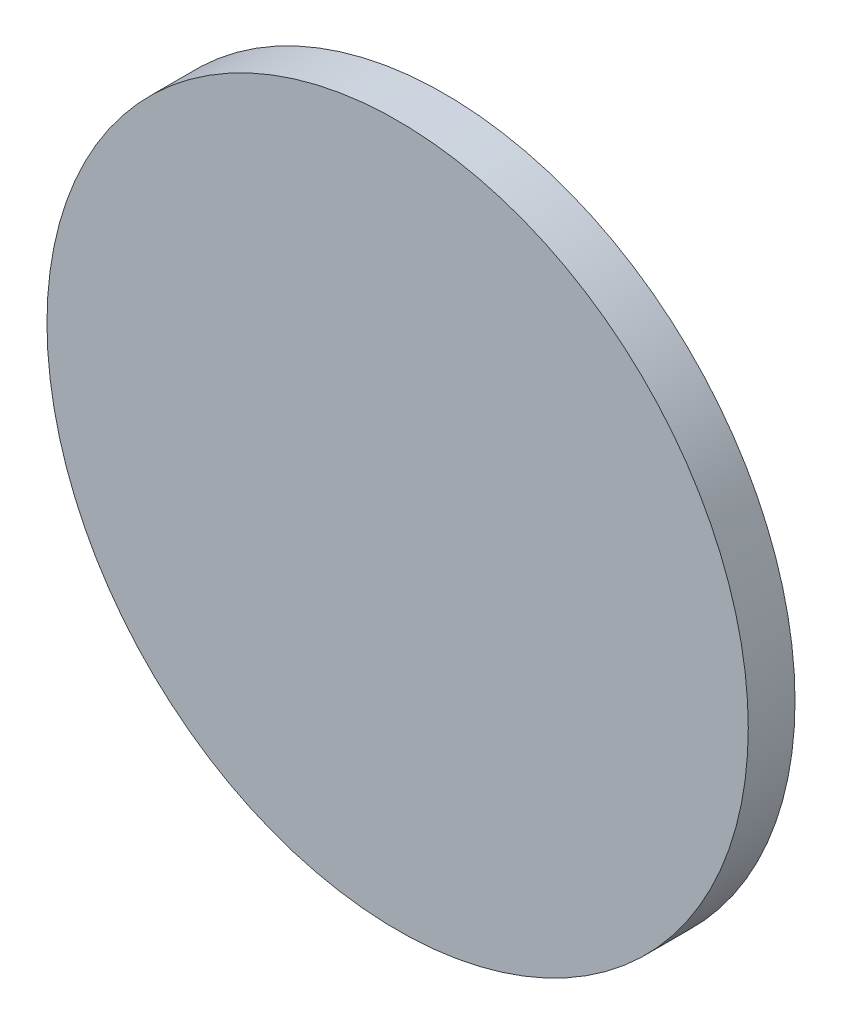
ISO-10303-21;
HEADER;
FILE_DESCRIPTION(('STEP AP214'),'2;1');
FILE_NAME('part.step','',(''),(''),'','','');
FILE_SCHEMA(('AUTOMOTIVE_DESIGN { 1 0 10303 214 1 1 1 1 }'));
ENDSEC;
DATA;
#1=APPLICATION_CONTEXT('core data for automotive mechanical design processes');
#2=APPLICATION_PROTOCOL_DEFINITION('international standard','automotive_design',2000,#1);
#3=PRODUCT_CONTEXT('',#1,'mechanical');
#4=PRODUCT('Part','Part','',(#3));
#5=PRODUCT_RELATED_PRODUCT_CATEGORY('part','',(#4));
#6=PRODUCT_DEFINITION_FORMATION('','',#4);
#7=PRODUCT_DEFINITION_CONTEXT('part definition',#1,'design');
#8=PRODUCT_DEFINITION('design','',#6,#7);
#9=PRODUCT_DEFINITION_SHAPE('','',#8);
#10=(LENGTH_UNIT() NAMED_UNIT(*) SI_UNIT(.MILLI.,.METRE.));
#11=(NAMED_UNIT(*) PLANE_ANGLE_UNIT() SI_UNIT($,.RADIAN.));
#12=(NAMED_UNIT(*) SI_UNIT($,.STERADIAN.) SOLID_ANGLE_UNIT());
#13=UNCERTAINTY_MEASURE_WITH_UNIT(LENGTH_MEASURE(1.E-05),#10,'distance_accuracy_value','');
#14=(GEOMETRIC_REPRESENTATION_CONTEXT(3) GLOBAL_UNCERTAINTY_ASSIGNED_CONTEXT((#13)) GLOBAL_UNIT_ASSIGNED_CONTEXT((#10,
#11,#12)) REPRESENTATION_CONTEXT('',''));
#15=CARTESIAN_POINT('',(0.,0.,0.));
#16=DIRECTION('',(0.,0.,1.));
#17=DIRECTION('',(1.,0.,0.));
#18=AXIS2_PLACEMENT_3D('',#15,#16,#17);
#19=CARTESIAN_POINT('',(0.,0.,0.));
#20=DIRECTION('',(0.,0.,1.));
#21=DIRECTION('',(1.,0.,0.));
#22=AXIS2_PLACEMENT_3D('',#19,#20,#21);
#23=PLANE('',#22);
#24=CARTESIAN_POINT('',(0.,0.,0.));
#25=DIRECTION('',(0.,0.,1.));
#26=DIRECTION('',(1.,0.,0.));
#27=AXIS2_PLACEMENT_3D('',#24,#25,#26);
#28=CIRCLE('',#27,0.15);
#29=CARTESIAN_POINT('',(0.15,0.,0.));
#30=VERTEX_POINT('',#29);
#31=EDGE_CURVE('E18',#30,#30,#28,.T.);
#32=ORIENTED_EDGE('',*,*,#31,.F.);
#33=EDGE_LOOP('',(#32));
#34=FACE_BOUND('',#33,.T.);
#35=ADVANCED_FACE('F15',(#34),#23,.F.);
#36=CARTESIAN_POINT('',(0.,0.,0.));
#37=DIRECTION('',(0.,0.,1.));
#38=DIRECTION('',(1.,0.,0.));
#39=AXIS2_PLACEMENT_3D('',#36,#37,#38);
#40=CYLINDRICAL_SURFACE('',#39,0.15);
#41=ORIENTED_EDGE('',*,*,#31,.T.);
#42=EDGE_LOOP('',(#41));
#43=FACE_BOUND('',#42,.T.);
#44=CARTESIAN_POINT('',(0.,0.,0.02));
#45=DIRECTION('',(0.,0.,1.));
#46=DIRECTION('',(1.,0.,0.));
#47=AXIS2_PLACEMENT_3D('',#44,#45,#46);
#48=CIRCLE('',#47,0.15);
#49=CARTESIAN_POINT('',(0.15,0.,0.02));
#50=VERTEX_POINT('',#49);
#51=EDGE_CURVE('E10',#50,#50,#48,.T.);
#52=ORIENTED_EDGE('',*,*,#51,.F.);
#53=EDGE_LOOP('',(#52));
#54=FACE_BOUND('',#53,.T.);
#55=ADVANCED_FACE('F27',(#43,#54),#40,.T.);
#56=CARTESIAN_POINT('',(0.,0.,0.02));
#57=DIRECTION('',(0.,0.,1.));
#58=DIRECTION('',(1.,0.,0.));
#59=AXIS2_PLACEMENT_3D('',#56,#57,#58);
#60=PLANE('',#59);
#61=ORIENTED_EDGE('',*,*,#51,.T.);
#62=EDGE_LOOP('',(#61));
#63=FACE_BOUND('',#62,.T.);
#64=ADVANCED_FACE('F35',(#63),#60,.T.);
#65=CLOSED_SHELL('',(#35,#55,#64));
#66=MANIFOLD_SOLID_BREP('B1',#65);
#67=ADVANCED_BREP_SHAPE_REPRESENTATION('',(#18,#66),#14);
#68=SHAPE_DEFINITION_REPRESENTATION(#9,#67);
ENDSEC;
END-ISO-10303-21;
